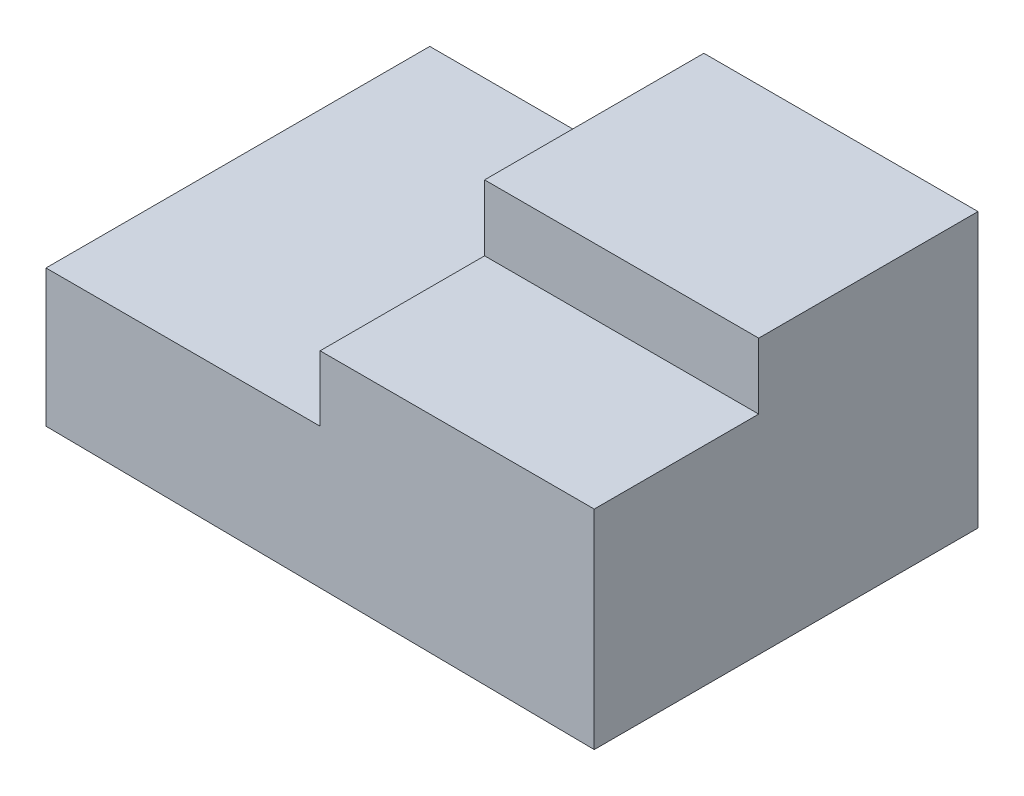
ISO-10303-21;
HEADER;
FILE_DESCRIPTION(('STEP AP214'),'2;1');
FILE_NAME('part.step','',(''),(''),'','','');
FILE_SCHEMA(('AUTOMOTIVE_DESIGN { 1 0 10303 214 1 1 1 1 }'));
ENDSEC;
DATA;
#1=APPLICATION_CONTEXT('core data for automotive mechanical design processes');
#2=APPLICATION_PROTOCOL_DEFINITION('international standard','automotive_design',2000,#1);
#3=PRODUCT_CONTEXT('',#1,'mechanical');
#4=PRODUCT('Part','Part','',(#3));
#5=PRODUCT_RELATED_PRODUCT_CATEGORY('part','',(#4));
#6=PRODUCT_DEFINITION_FORMATION('','',#4);
#7=PRODUCT_DEFINITION_CONTEXT('part definition',#1,'design');
#8=PRODUCT_DEFINITION('design','',#6,#7);
#9=PRODUCT_DEFINITION_SHAPE('','',#8);
#10=(LENGTH_UNIT() NAMED_UNIT(*) SI_UNIT(.MILLI.,.METRE.));
#11=(NAMED_UNIT(*) PLANE_ANGLE_UNIT() SI_UNIT($,.RADIAN.));
#12=(NAMED_UNIT(*) SI_UNIT($,.STERADIAN.) SOLID_ANGLE_UNIT());
#13=UNCERTAINTY_MEASURE_WITH_UNIT(LENGTH_MEASURE(1.E-05),#10,'distance_accuracy_value','');
#14=(GEOMETRIC_REPRESENTATION_CONTEXT(3) GLOBAL_UNCERTAINTY_ASSIGNED_CONTEXT((#13)) GLOBAL_UNIT_ASSIGNED_CONTEXT((#10,
#11,#12)) REPRESENTATION_CONTEXT('',''));
#15=CARTESIAN_POINT('',(0.,0.,0.));
#16=DIRECTION('',(0.,0.,1.));
#17=DIRECTION('',(1.,0.,0.));
#18=AXIS2_PLACEMENT_3D('',#15,#16,#17);
#19=CARTESIAN_POINT('',(50.,25.,70.));
#20=DIRECTION('',(0.,-1.,0.));
#21=DIRECTION('',(1.,0.,0.));
#22=AXIS2_PLACEMENT_3D('',#19,#20,#21);
#23=PLANE('',#22);
#24=DIRECTION('',(-1.,0.,0.));
#25=VECTOR('',#24,1.);
#26=CARTESIAN_POINT('',(50.,25.,0.));
#27=LINE('',#26,#25);
#28=CARTESIAN_POINT('',(50.,25.,0.));
#29=VERTEX_POINT('',#28);
#30=CARTESIAN_POINT('',(0.,25.,0.));
#31=VERTEX_POINT('',#30);
#32=EDGE_CURVE('E138',#29,#31,#27,.T.);
#33=ORIENTED_EDGE('',*,*,#32,.T.);
#34=DIRECTION('',(0.,0.,-1.));
#35=VECTOR('',#34,1.);
#36=CARTESIAN_POINT('',(0.,25.,70.));
#37=LINE('',#36,#35);
#38=CARTESIAN_POINT('',(0.,25.,70.));
#39=VERTEX_POINT('',#38);
#40=EDGE_CURVE('E11',#39,#31,#37,.T.);
#41=ORIENTED_EDGE('',*,*,#40,.F.);
#42=DIRECTION('',(-1.,0.,0.));
#43=VECTOR('',#42,1.);
#44=CARTESIAN_POINT('',(50.,25.,70.));
#45=LINE('',#44,#43);
#46=CARTESIAN_POINT('',(50.,25.,70.));
#47=VERTEX_POINT('',#46);
#48=EDGE_CURVE('E153',#47,#39,#45,.T.);
#49=ORIENTED_EDGE('',*,*,#48,.F.);
#50=DIRECTION('',(0.,0.,-1.));
#51=VECTOR('',#50,1.);
#52=CARTESIAN_POINT('',(50.,25.,70.));
#53=LINE('',#52,#51);
#54=EDGE_CURVE('E134',#47,#29,#53,.T.);
#55=ORIENTED_EDGE('',*,*,#54,.T.);
#56=EDGE_LOOP('',(#33,#41,#49,#55));
#57=FACE_BOUND('',#56,.T.);
#58=ADVANCED_FACE('F40',(#57),#23,.F.);
#59=CARTESIAN_POINT('',(0.,25.,70.));
#60=DIRECTION('',(1.,0.,0.));
#61=DIRECTION('',(0.,1.,0.));
#62=AXIS2_PLACEMENT_3D('',#59,#60,#61);
#63=PLANE('',#62);
#64=DIRECTION('',(0.,-1.,0.));
#65=VECTOR('',#64,1.);
#66=CARTESIAN_POINT('',(0.,25.,0.));
#67=LINE('',#66,#65);
#68=CARTESIAN_POINT('',(0.,0.,0.));
#69=VERTEX_POINT('',#68);
#70=EDGE_CURVE('E142',#31,#69,#67,.T.);
#71=ORIENTED_EDGE('',*,*,#70,.T.);
#72=DIRECTION('',(0.,0.,-1.));
#73=VECTOR('',#72,1.);
#74=CARTESIAN_POINT('',(0.,0.,70.));
#75=LINE('',#74,#73);
#76=CARTESIAN_POINT('',(0.,0.,70.));
#77=VERTEX_POINT('',#76);
#78=EDGE_CURVE('E48',#77,#69,#75,.T.);
#79=ORIENTED_EDGE('',*,*,#78,.F.);
#80=DIRECTION('',(0.,-1.,0.));
#81=VECTOR('',#80,1.);
#82=CARTESIAN_POINT('',(0.,25.,70.));
#83=LINE('',#82,#81);
#84=EDGE_CURVE('E93',#39,#77,#83,.T.);
#85=ORIENTED_EDGE('',*,*,#84,.F.);
#86=ORIENTED_EDGE('',*,*,#40,.T.);
#87=EDGE_LOOP('',(#71,#79,#85,#86));
#88=FACE_BOUND('',#87,.T.);
#89=ADVANCED_FACE('F205',(#88),#63,.F.);
#90=CARTESIAN_POINT('',(0.,0.,70.));
#91=DIRECTION('',(0.0108492710118694,0.999941144927296,0.));
#92=DIRECTION('',(-0.999941144927296,0.0108492710118694,0.));
#93=AXIS2_PLACEMENT_3D('',#90,#91,#92);
#94=PLANE('',#93);
#95=DIRECTION('',(0.999941144927296,-0.0108492710118694,0.));
#96=VECTOR('',#95,1.);
#97=CARTESIAN_POINT('',(0.,0.,0.));
#98=LINE('',#97,#96);
#99=CARTESIAN_POINT('',(100.,-1.08499095840868,0.));
#100=VERTEX_POINT('',#99);
#101=EDGE_CURVE('E145',#69,#100,#98,.T.);
#102=ORIENTED_EDGE('',*,*,#101,.T.);
#103=DIRECTION('',(0.,0.,-1.));
#104=VECTOR('',#103,1.);
#105=CARTESIAN_POINT('',(100.,-1.08499095840868,70.));
#106=LINE('',#105,#104);
#107=CARTESIAN_POINT('',(100.,-1.08499095840868,70.));
#108=VERTEX_POINT('',#107);
#109=EDGE_CURVE('E126',#108,#100,#106,.T.);
#110=ORIENTED_EDGE('',*,*,#109,.F.);
#111=DIRECTION('',(0.999941144927296,-0.0108492710118694,0.));
#112=VECTOR('',#111,1.);
#113=CARTESIAN_POINT('',(0.,0.,70.));
#114=LINE('',#113,#112);
#115=EDGE_CURVE('E110',#77,#108,#114,.T.);
#116=ORIENTED_EDGE('',*,*,#115,.F.);
#117=ORIENTED_EDGE('',*,*,#78,.T.);
#118=EDGE_LOOP('',(#102,#110,#116,#117));
#119=FACE_BOUND('',#118,.T.);
#120=ADVANCED_FACE('F163',(#119),#94,.F.);
#121=CARTESIAN_POINT('',(100.,-1.08499095840868,70.));
#122=DIRECTION('',(-1.,0.,0.));
#123=DIRECTION('',(0.,0.,1.));
#124=AXIS2_PLACEMENT_3D('',#121,#122,#123);
#125=PLANE('',#124);
#126=DIRECTION('',(0.,1.,0.));
#127=VECTOR('',#126,1.);
#128=CARTESIAN_POINT('',(100.,-1.08499095840868,0.));
#129=LINE('',#128,#127);
#130=CARTESIAN_POINT('',(100.,48.9150090415913,0.));
#131=VERTEX_POINT('',#130);
#132=EDGE_CURVE('E148',#100,#131,#129,.T.);
#133=ORIENTED_EDGE('',*,*,#132,.T.);
#134=DIRECTION('',(0.,0.,1.));
#135=VECTOR('',#134,1.);
#136=CARTESIAN_POINT('',(100.,48.9150090415913,0.));
#137=LINE('',#136,#135);
#138=CARTESIAN_POINT('',(100.,48.9150090415913,40.));
#139=VERTEX_POINT('',#138);
#140=EDGE_CURVE('E174',#131,#139,#137,.T.);
#141=ORIENTED_EDGE('',*,*,#140,.T.);
#142=DIRECTION('',(0.,-1.,0.));
#143=VECTOR('',#142,1.);
#144=CARTESIAN_POINT('',(100.,48.9150090415913,40.));
#145=LINE('',#144,#143);
#146=CARTESIAN_POINT('',(100.,36.9150090415913,40.));
#147=VERTEX_POINT('',#146);
#148=EDGE_CURVE('E123',#139,#147,#145,.T.);
#149=ORIENTED_EDGE('',*,*,#148,.T.);
#150=DIRECTION('',(0.,0.,-1.));
#151=VECTOR('',#150,1.);
#152=CARTESIAN_POINT('',(100.,36.9150090415913,70.));
#153=LINE('',#152,#151);
#154=CARTESIAN_POINT('',(100.,36.9150090415913,70.));
#155=VERTEX_POINT('',#154);
#156=EDGE_CURVE('E118',#155,#147,#153,.T.);
#157=ORIENTED_EDGE('',*,*,#156,.F.);
#158=DIRECTION('',(0.,1.,0.));
#159=VECTOR('',#158,1.);
#160=CARTESIAN_POINT('',(100.,-1.08499095840868,70.));
#161=LINE('',#160,#159);
#162=EDGE_CURVE('E103',#108,#155,#161,.T.);
#163=ORIENTED_EDGE('',*,*,#162,.F.);
#164=ORIENTED_EDGE('',*,*,#109,.T.);
#165=EDGE_LOOP('',(#133,#141,#149,#157,#163,#164));
#166=FACE_BOUND('',#165,.T.);
#167=ADVANCED_FACE('F120',(#166),#125,.F.);
#168=CARTESIAN_POINT('',(100.,36.9150090415913,70.));
#169=DIRECTION('',(0.,-1.,0.));
#170=DIRECTION('',(1.,0.,0.));
#171=AXIS2_PLACEMENT_3D('',#168,#169,#170);
#172=PLANE('',#171);
#173=ORIENTED_EDGE('',*,*,#156,.T.);
#174=DIRECTION('',(-1.,0.,0.));
#175=VECTOR('',#174,1.);
#176=CARTESIAN_POINT('',(100.,36.9150090415913,40.));
#177=LINE('',#176,#175);
#178=CARTESIAN_POINT('',(50.,36.9150090415913,40.));
#179=VERTEX_POINT('',#178);
#180=EDGE_CURVE('E191',#147,#179,#177,.T.);
#181=ORIENTED_EDGE('',*,*,#180,.T.);
#182=DIRECTION('',(0.,0.,-1.));
#183=VECTOR('',#182,1.);
#184=CARTESIAN_POINT('',(50.,36.9150090415913,70.));
#185=LINE('',#184,#183);
#186=CARTESIAN_POINT('',(50.,36.9150090415913,70.));
#187=VERTEX_POINT('',#186);
#188=EDGE_CURVE('E127',#187,#179,#185,.T.);
#189=ORIENTED_EDGE('',*,*,#188,.F.);
#190=DIRECTION('',(-1.,0.,0.));
#191=VECTOR('',#190,1.);
#192=CARTESIAN_POINT('',(100.,36.9150090415913,70.));
#193=LINE('',#192,#191);
#194=EDGE_CURVE('E107',#155,#187,#193,.T.);
#195=ORIENTED_EDGE('',*,*,#194,.F.);
#196=EDGE_LOOP('',(#173,#181,#189,#195));
#197=FACE_BOUND('',#196,.T.);
#198=ADVANCED_FACE('F129',(#197),#172,.F.);
#199=CARTESIAN_POINT('',(50.,36.9150090415913,70.));
#200=DIRECTION('',(1.,0.,0.));
#201=DIRECTION('',(0.,0.,-1.));
#202=AXIS2_PLACEMENT_3D('',#199,#200,#201);
#203=PLANE('',#202);
#204=DIRECTION('',(0.,-1.,0.));
#205=VECTOR('',#204,1.);
#206=CARTESIAN_POINT('',(50.,36.9150090415913,0.));
#207=LINE('',#206,#205);
#208=CARTESIAN_POINT('',(50.,48.9150090415913,0.));
#209=VERTEX_POINT('',#208);
#210=EDGE_CURVE('E85',#209,#29,#207,.T.);
#211=ORIENTED_EDGE('',*,*,#210,.T.);
#212=ORIENTED_EDGE('',*,*,#54,.F.);
#213=DIRECTION('',(0.,-1.,0.));
#214=VECTOR('',#213,1.);
#215=CARTESIAN_POINT('',(50.,36.9150090415913,70.));
#216=LINE('',#215,#214);
#217=EDGE_CURVE('E64',#187,#47,#216,.T.);
#218=ORIENTED_EDGE('',*,*,#217,.F.);
#219=ORIENTED_EDGE('',*,*,#188,.T.);
#220=DIRECTION('',(0.,-1.,0.));
#221=VECTOR('',#220,1.);
#222=CARTESIAN_POINT('',(50.,48.9150090415913,40.));
#223=LINE('',#222,#221);
#224=CARTESIAN_POINT('',(50.,48.9150090415913,40.));
#225=VERTEX_POINT('',#224);
#226=EDGE_CURVE('E55',#225,#179,#223,.T.);
#227=ORIENTED_EDGE('',*,*,#226,.F.);
#228=DIRECTION('',(0.,0.,-1.));
#229=VECTOR('',#228,1.);
#230=CARTESIAN_POINT('',(50.,48.9150090415913,40.));
#231=LINE('',#230,#229);
#232=EDGE_CURVE('E187',#225,#209,#231,.T.);
#233=ORIENTED_EDGE('',*,*,#232,.T.);
#234=EDGE_LOOP('',(#211,#212,#218,#219,#227,#233));
#235=FACE_BOUND('',#234,.T.);
#236=ADVANCED_FACE('F217',(#235),#203,.F.);
#237=CARTESIAN_POINT('',(0.,0.,70.));
#238=DIRECTION('',(0.,0.,1.));
#239=DIRECTION('',(1.,0.,0.));
#240=AXIS2_PLACEMENT_3D('',#237,#238,#239);
#241=PLANE('',#240);
#242=ORIENTED_EDGE('',*,*,#48,.T.);
#243=ORIENTED_EDGE('',*,*,#84,.T.);
#244=ORIENTED_EDGE('',*,*,#115,.T.);
#245=ORIENTED_EDGE('',*,*,#162,.T.);
#246=ORIENTED_EDGE('',*,*,#194,.T.);
#247=ORIENTED_EDGE('',*,*,#217,.T.);
#248=EDGE_LOOP('',(#242,#243,#244,#245,#246,#247));
#249=FACE_BOUND('',#248,.T.);
#250=ADVANCED_FACE('F105',(#249),#241,.T.);
#251=CARTESIAN_POINT('',(0.,0.,0.));
#252=DIRECTION('',(0.,0.,1.));
#253=DIRECTION('',(1.,0.,0.));
#254=AXIS2_PLACEMENT_3D('',#251,#252,#253);
#255=PLANE('',#254);
#256=ORIENTED_EDGE('',*,*,#32,.F.);
#257=ORIENTED_EDGE('',*,*,#210,.F.);
#258=DIRECTION('',(1.,0.,0.));
#259=VECTOR('',#258,1.);
#260=CARTESIAN_POINT('',(50.,48.9150090415913,0.));
#261=LINE('',#260,#259);
#262=EDGE_CURVE('E171',#209,#131,#261,.T.);
#263=ORIENTED_EDGE('',*,*,#262,.T.);
#264=ORIENTED_EDGE('',*,*,#132,.F.);
#265=ORIENTED_EDGE('',*,*,#101,.F.);
#266=ORIENTED_EDGE('',*,*,#70,.F.);
#267=EDGE_LOOP('',(#256,#257,#263,#264,#265,#266));
#268=FACE_BOUND('',#267,.T.);
#269=ADVANCED_FACE('F167',(#268),#255,.F.);
#270=CARTESIAN_POINT('',(100.,48.9150090415913,40.));
#271=DIRECTION('',(0.,0.,1.));
#272=DIRECTION('',(1.,0.,0.));
#273=AXIS2_PLACEMENT_3D('',#270,#271,#272);
#274=PLANE('',#273);
#275=ORIENTED_EDGE('',*,*,#180,.F.);
#276=ORIENTED_EDGE('',*,*,#148,.F.);
#277=DIRECTION('',(-1.,0.,0.));
#278=VECTOR('',#277,1.);
#279=CARTESIAN_POINT('',(100.,48.9150090415913,40.));
#280=LINE('',#279,#278);
#281=EDGE_CURVE('E181',#139,#225,#280,.T.);
#282=ORIENTED_EDGE('',*,*,#281,.T.);
#283=ORIENTED_EDGE('',*,*,#226,.T.);
#284=EDGE_LOOP('',(#275,#276,#282,#283));
#285=FACE_BOUND('',#284,.T.);
#286=ADVANCED_FACE('F222',(#285),#274,.T.);
#287=CARTESIAN_POINT('',(0.,48.9150090415913,0.));
#288=DIRECTION('',(0.,-1.,0.));
#289=DIRECTION('',(1.,0.,0.));
#290=AXIS2_PLACEMENT_3D('',#287,#288,#289);
#291=PLANE('',#290);
#292=ORIENTED_EDGE('',*,*,#232,.F.);
#293=ORIENTED_EDGE('',*,*,#281,.F.);
#294=ORIENTED_EDGE('',*,*,#140,.F.);
#295=ORIENTED_EDGE('',*,*,#262,.F.);
#296=EDGE_LOOP('',(#292,#293,#294,#295));
#297=FACE_BOUND('',#296,.T.);
#298=ADVANCED_FACE('F180',(#297),#291,.F.);
#299=CLOSED_SHELL('',(#58,#89,#120,#167,#198,#236,#250,#269,#286,#298));
#300=MANIFOLD_SOLID_BREP('B2',#299);
#301=ADVANCED_BREP_SHAPE_REPRESENTATION('',(#18,#300),#14);
#302=SHAPE_DEFINITION_REPRESENTATION(#9,#301);
ENDSEC;
END-ISO-10303-21;
